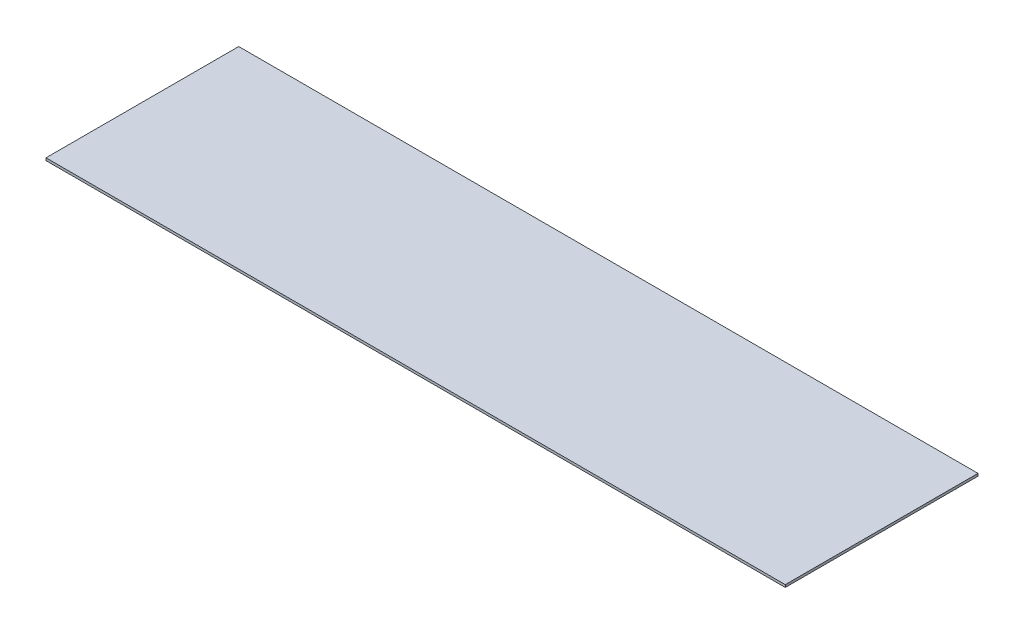
ISO-10303-21;
HEADER;
FILE_DESCRIPTION(('STEP AP214'),'2;1');
FILE_NAME('part.step','',(''),(''),'','','');
FILE_SCHEMA(('AUTOMOTIVE_DESIGN { 1 0 10303 214 1 1 1 1 }'));
ENDSEC;
DATA;
#1=APPLICATION_CONTEXT('core data for automotive mechanical design processes');
#2=APPLICATION_PROTOCOL_DEFINITION('international standard','automotive_design',2000,#1);
#3=PRODUCT_CONTEXT('',#1,'mechanical');
#4=PRODUCT('Part','Part','',(#3));
#5=PRODUCT_RELATED_PRODUCT_CATEGORY('part','',(#4));
#6=PRODUCT_DEFINITION_FORMATION('','',#4);
#7=PRODUCT_DEFINITION_CONTEXT('part definition',#1,'design');
#8=PRODUCT_DEFINITION('design','',#6,#7);
#9=PRODUCT_DEFINITION_SHAPE('','',#8);
#10=(LENGTH_UNIT() NAMED_UNIT(*) SI_UNIT(.MILLI.,.METRE.));
#11=(NAMED_UNIT(*) PLANE_ANGLE_UNIT() SI_UNIT($,.RADIAN.));
#12=(NAMED_UNIT(*) SI_UNIT($,.STERADIAN.) SOLID_ANGLE_UNIT());
#13=UNCERTAINTY_MEASURE_WITH_UNIT(LENGTH_MEASURE(1.E-05),#10,'distance_accuracy_value','');
#14=(GEOMETRIC_REPRESENTATION_CONTEXT(3) GLOBAL_UNCERTAINTY_ASSIGNED_CONTEXT((#13)) GLOBAL_UNIT_ASSIGNED_CONTEXT((#10,
#11,#12)) REPRESENTATION_CONTEXT('',''));
#15=CARTESIAN_POINT('',(0.,0.,0.));
#16=DIRECTION('',(0.,0.,1.));
#17=DIRECTION('',(1.,0.,0.));
#18=AXIS2_PLACEMENT_3D('',#15,#16,#17);
#19=CARTESIAN_POINT('',(237.744,1.5875,61.976));
#20=DIRECTION('',(-1.,0.,0.));
#21=DIRECTION('',(0.,0.,1.));
#22=AXIS2_PLACEMENT_3D('',#19,#20,#21);
#23=PLANE('',#22);
#24=DIRECTION('',(0.,0.,-1.));
#25=VECTOR('',#24,1.);
#26=CARTESIAN_POINT('',(237.744,0.,61.976));
#27=LINE('',#26,#25);
#28=CARTESIAN_POINT('',(237.744,0.,61.976));
#29=VERTEX_POINT('',#28);
#30=CARTESIAN_POINT('',(237.744,0.,-61.976));
#31=VERTEX_POINT('',#30);
#32=EDGE_CURVE('E100',#29,#31,#27,.T.);
#33=ORIENTED_EDGE('',*,*,#32,.T.);
#34=DIRECTION('',(0.,-1.,0.));
#35=VECTOR('',#34,1.);
#36=CARTESIAN_POINT('',(237.744,1.5875,-61.976));
#37=LINE('',#36,#35);
#38=CARTESIAN_POINT('',(237.744,1.5875,-61.976));
#39=VERTEX_POINT('',#38);
#40=EDGE_CURVE('E11',#39,#31,#37,.T.);
#41=ORIENTED_EDGE('',*,*,#40,.F.);
#42=DIRECTION('',(0.,0.,-1.));
#43=VECTOR('',#42,1.);
#44=CARTESIAN_POINT('',(237.744,1.5875,61.976));
#45=LINE('',#44,#43);
#46=CARTESIAN_POINT('',(237.744,1.5875,61.976));
#47=VERTEX_POINT('',#46);
#48=EDGE_CURVE('E88',#47,#39,#45,.T.);
#49=ORIENTED_EDGE('',*,*,#48,.F.);
#50=DIRECTION('',(0.,-1.,0.));
#51=VECTOR('',#50,1.);
#52=CARTESIAN_POINT('',(237.744,1.5875,61.976));
#53=LINE('',#52,#51);
#54=EDGE_CURVE('E96',#47,#29,#53,.T.);
#55=ORIENTED_EDGE('',*,*,#54,.T.);
#56=EDGE_LOOP('',(#33,#41,#49,#55));
#57=FACE_BOUND('',#56,.T.);
#58=ADVANCED_FACE('F37',(#57),#23,.F.);
#59=CARTESIAN_POINT('',(-237.744,1.5875,-61.976));
#60=DIRECTION('',(0.,0.,1.));
#61=DIRECTION('',(1.,0.,0.));
#62=AXIS2_PLACEMENT_3D('',#59,#60,#61);
#63=PLANE('',#62);
#64=DIRECTION('',(-1.,0.,0.));
#65=VECTOR('',#64,1.);
#66=CARTESIAN_POINT('',(-237.744,0.,-61.976));
#67=LINE('',#66,#65);
#68=CARTESIAN_POINT('',(-237.744,0.,-61.976));
#69=VERTEX_POINT('',#68);
#70=EDGE_CURVE('E92',#31,#69,#67,.T.);
#71=ORIENTED_EDGE('',*,*,#70,.T.);
#72=DIRECTION('',(0.,-1.,0.));
#73=VECTOR('',#72,1.);
#74=CARTESIAN_POINT('',(-237.744,1.5875,-61.976));
#75=LINE('',#74,#73);
#76=CARTESIAN_POINT('',(-237.744,1.5875,-61.976));
#77=VERTEX_POINT('',#76);
#78=EDGE_CURVE('E45',#77,#69,#75,.T.);
#79=ORIENTED_EDGE('',*,*,#78,.F.);
#80=DIRECTION('',(-1.,0.,0.));
#81=VECTOR('',#80,1.);
#82=CARTESIAN_POINT('',(-237.744,1.5875,-61.976));
#83=LINE('',#82,#81);
#84=EDGE_CURVE('E83',#39,#77,#83,.T.);
#85=ORIENTED_EDGE('',*,*,#84,.F.);
#86=ORIENTED_EDGE('',*,*,#40,.T.);
#87=EDGE_LOOP('',(#71,#79,#85,#86));
#88=FACE_BOUND('',#87,.T.);
#89=ADVANCED_FACE('F91',(#88),#63,.F.);
#90=CARTESIAN_POINT('',(-237.744,1.5875,61.976));
#91=DIRECTION('',(1.,0.,0.));
#92=DIRECTION('',(0.,0.,-1.));
#93=AXIS2_PLACEMENT_3D('',#90,#91,#92);
#94=PLANE('',#93);
#95=DIRECTION('',(0.,0.,1.));
#96=VECTOR('',#95,1.);
#97=CARTESIAN_POINT('',(-237.744,0.,61.976));
#98=LINE('',#97,#96);
#99=CARTESIAN_POINT('',(-237.744,0.,61.976));
#100=VERTEX_POINT('',#99);
#101=EDGE_CURVE('E70',#69,#100,#98,.T.);
#102=ORIENTED_EDGE('',*,*,#101,.T.);
#103=DIRECTION('',(0.,-1.,0.));
#104=VECTOR('',#103,1.);
#105=CARTESIAN_POINT('',(-237.744,1.5875,61.976));
#106=LINE('',#105,#104);
#107=CARTESIAN_POINT('',(-237.744,1.5875,61.976));
#108=VERTEX_POINT('',#107);
#109=EDGE_CURVE('E93',#108,#100,#106,.T.);
#110=ORIENTED_EDGE('',*,*,#109,.F.);
#111=DIRECTION('',(0.,0.,1.));
#112=VECTOR('',#111,1.);
#113=CARTESIAN_POINT('',(-237.744,1.5875,61.976));
#114=LINE('',#113,#112);
#115=EDGE_CURVE('E86',#77,#108,#114,.T.);
#116=ORIENTED_EDGE('',*,*,#115,.F.);
#117=ORIENTED_EDGE('',*,*,#78,.T.);
#118=EDGE_LOOP('',(#102,#110,#116,#117));
#119=FACE_BOUND('',#118,.T.);
#120=ADVANCED_FACE('F94',(#119),#94,.F.);
#121=CARTESIAN_POINT('',(-237.744,1.5875,61.976));
#122=DIRECTION('',(0.,0.,-1.));
#123=DIRECTION('',(-1.,0.,0.));
#124=AXIS2_PLACEMENT_3D('',#121,#122,#123);
#125=PLANE('',#124);
#126=DIRECTION('',(1.,0.,0.));
#127=VECTOR('',#126,1.);
#128=CARTESIAN_POINT('',(-237.744,0.,61.976));
#129=LINE('',#128,#127);
#130=EDGE_CURVE('E76',#100,#29,#129,.T.);
#131=ORIENTED_EDGE('',*,*,#130,.T.);
#132=ORIENTED_EDGE('',*,*,#54,.F.);
#133=DIRECTION('',(1.,0.,0.));
#134=VECTOR('',#133,1.);
#135=CARTESIAN_POINT('',(-237.744,1.5875,61.976));
#136=LINE('',#135,#134);
#137=EDGE_CURVE('E53',#108,#47,#136,.T.);
#138=ORIENTED_EDGE('',*,*,#137,.F.);
#139=ORIENTED_EDGE('',*,*,#109,.T.);
#140=EDGE_LOOP('',(#131,#132,#138,#139));
#141=FACE_BOUND('',#140,.T.);
#142=ADVANCED_FACE('F107',(#141),#125,.F.);
#143=CARTESIAN_POINT('',(0.,1.5875,0.));
#144=DIRECTION('',(0.,-1.,0.));
#145=DIRECTION('',(0.,0.,-1.));
#146=AXIS2_PLACEMENT_3D('',#143,#144,#145);
#147=PLANE('',#146);
#148=ORIENTED_EDGE('',*,*,#48,.T.);
#149=ORIENTED_EDGE('',*,*,#84,.T.);
#150=ORIENTED_EDGE('',*,*,#115,.T.);
#151=ORIENTED_EDGE('',*,*,#137,.T.);
#152=EDGE_LOOP('',(#148,#149,#150,#151));
#153=FACE_BOUND('',#152,.T.);
#154=ADVANCED_FACE('F84',(#153),#147,.F.);
#155=CARTESIAN_POINT('',(0.,0.,0.));
#156=DIRECTION('',(0.,-1.,0.));
#157=DIRECTION('',(0.,0.,-1.));
#158=AXIS2_PLACEMENT_3D('',#155,#156,#157);
#159=PLANE('',#158);
#160=ORIENTED_EDGE('',*,*,#32,.F.);
#161=ORIENTED_EDGE('',*,*,#130,.F.);
#162=ORIENTED_EDGE('',*,*,#101,.F.);
#163=ORIENTED_EDGE('',*,*,#70,.F.);
#164=EDGE_LOOP('',(#160,#161,#162,#163));
#165=FACE_BOUND('',#164,.T.);
#166=ADVANCED_FACE('F110',(#165),#159,.T.);
#167=CLOSED_SHELL('',(#58,#89,#120,#142,#154,#166));
#168=MANIFOLD_SOLID_BREP('B2',#167);
#169=ADVANCED_BREP_SHAPE_REPRESENTATION('',(#18,#168),#14);
#170=SHAPE_DEFINITION_REPRESENTATION(#9,#169);
ENDSEC;
END-ISO-10303-21;
